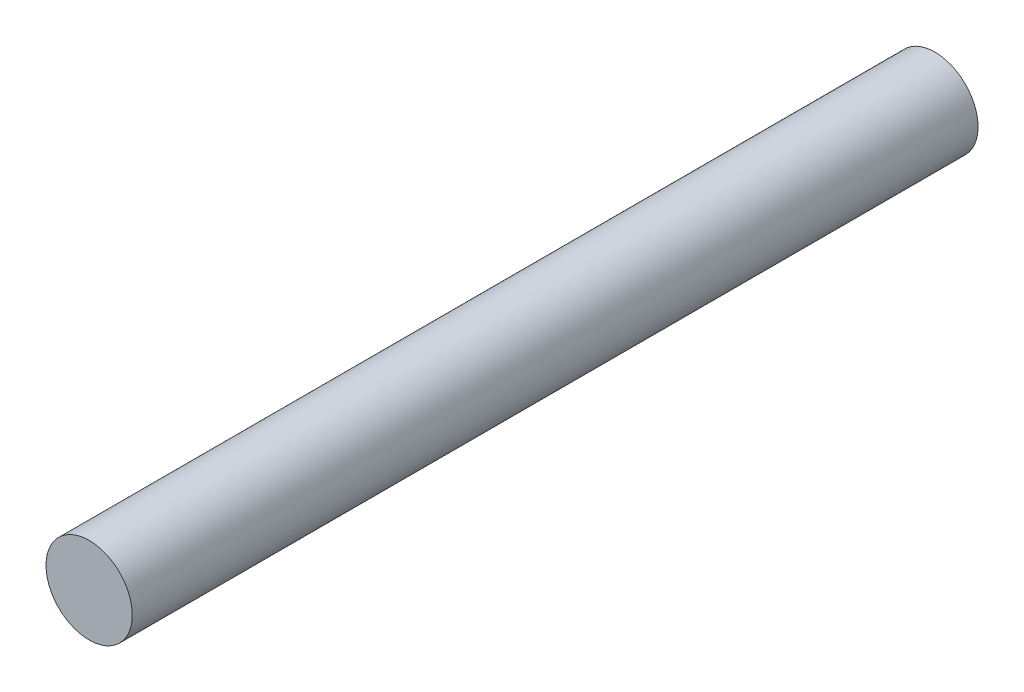
ISO-10303-21;
HEADER;
FILE_DESCRIPTION(('STEP AP214'),'2;1');
FILE_NAME('part.step','',(''),(''),'','','');
FILE_SCHEMA(('AUTOMOTIVE_DESIGN { 1 0 10303 214 1 1 1 1 }'));
ENDSEC;
DATA;
#1=APPLICATION_CONTEXT('core data for automotive mechanical design processes');
#2=APPLICATION_PROTOCOL_DEFINITION('international standard','automotive_design',2000,#1);
#3=PRODUCT_CONTEXT('',#1,'mechanical');
#4=PRODUCT('Part','Part','',(#3));
#5=PRODUCT_RELATED_PRODUCT_CATEGORY('part','',(#4));
#6=PRODUCT_DEFINITION_FORMATION('','',#4);
#7=PRODUCT_DEFINITION_CONTEXT('part definition',#1,'design');
#8=PRODUCT_DEFINITION('design','',#6,#7);
#9=PRODUCT_DEFINITION_SHAPE('','',#8);
#10=(LENGTH_UNIT() NAMED_UNIT(*) SI_UNIT(.MILLI.,.METRE.));
#11=(NAMED_UNIT(*) PLANE_ANGLE_UNIT() SI_UNIT($,.RADIAN.));
#12=(NAMED_UNIT(*) SI_UNIT($,.STERADIAN.) SOLID_ANGLE_UNIT());
#13=UNCERTAINTY_MEASURE_WITH_UNIT(LENGTH_MEASURE(1.E-05),#10,'distance_accuracy_value','');
#14=(GEOMETRIC_REPRESENTATION_CONTEXT(3) GLOBAL_UNCERTAINTY_ASSIGNED_CONTEXT((#13)) GLOBAL_UNIT_ASSIGNED_CONTEXT((#10,
#11,#12)) REPRESENTATION_CONTEXT('',''));
#15=CARTESIAN_POINT('',(0.,0.,0.));
#16=DIRECTION('',(0.,0.,1.));
#17=DIRECTION('',(1.,0.,0.));
#18=AXIS2_PLACEMENT_3D('',#15,#16,#17);
#19=CARTESIAN_POINT('',(0.,0.,-49.));
#20=DIRECTION('',(0.,0.,1.));
#21=DIRECTION('',(1.,0.,0.));
#22=AXIS2_PLACEMENT_3D('',#19,#20,#21);
#23=CYLINDRICAL_SURFACE('',#22,2.5);
#24=CARTESIAN_POINT('',(0.,0.,-49.));
#25=DIRECTION('',(0.,0.,-1.));
#26=DIRECTION('',(-1.,0.,0.));
#27=AXIS2_PLACEMENT_3D('',#24,#25,#26);
#28=CIRCLE('',#27,2.5);
#29=CARTESIAN_POINT('',(-2.5,0.,-49.));
#30=VERTEX_POINT('',#29);
#31=EDGE_CURVE('E11',#30,#30,#28,.T.);
#32=ORIENTED_EDGE('',*,*,#31,.F.);
#33=EDGE_LOOP('',(#32));
#34=FACE_BOUND('',#33,.T.);
#35=CARTESIAN_POINT('',(0.,0.,0.));
#36=DIRECTION('',(0.,0.,-1.));
#37=DIRECTION('',(-1.,0.,0.));
#38=AXIS2_PLACEMENT_3D('',#35,#36,#37);
#39=CIRCLE('',#38,2.5);
#40=CARTESIAN_POINT('',(-2.5,0.,0.));
#41=VERTEX_POINT('',#40);
#42=EDGE_CURVE('E41',#41,#41,#39,.T.);
#43=ORIENTED_EDGE('',*,*,#42,.T.);
#44=EDGE_LOOP('',(#43));
#45=FACE_BOUND('',#44,.T.);
#46=ADVANCED_FACE('F38',(#34,#45),#23,.T.);
#47=CARTESIAN_POINT('',(0.,0.,-49.));
#48=DIRECTION('',(0.,0.,-1.));
#49=DIRECTION('',(-1.,0.,0.));
#50=AXIS2_PLACEMENT_3D('',#47,#48,#49);
#51=PLANE('',#50);
#52=ORIENTED_EDGE('',*,*,#31,.T.);
#53=EDGE_LOOP('',(#52));
#54=FACE_BOUND('',#53,.T.);
#55=ADVANCED_FACE('F53',(#54),#51,.T.);
#56=CARTESIAN_POINT('',(0.,0.,0.));
#57=DIRECTION('',(0.,0.,-1.));
#58=DIRECTION('',(-1.,0.,0.));
#59=AXIS2_PLACEMENT_3D('',#56,#57,#58);
#60=PLANE('',#59);
#61=ORIENTED_EDGE('',*,*,#42,.F.);
#62=EDGE_LOOP('',(#61));
#63=FACE_BOUND('',#62,.T.);
#64=ADVANCED_FACE('F51',(#63),#60,.F.);
#65=CLOSED_SHELL('',(#46,#55,#64));
#66=MANIFOLD_SOLID_BREP('B2',#65);
#67=ADVANCED_BREP_SHAPE_REPRESENTATION('',(#18,#66),#14);
#68=SHAPE_DEFINITION_REPRESENTATION(#9,#67);
ENDSEC;
END-ISO-10303-21;
